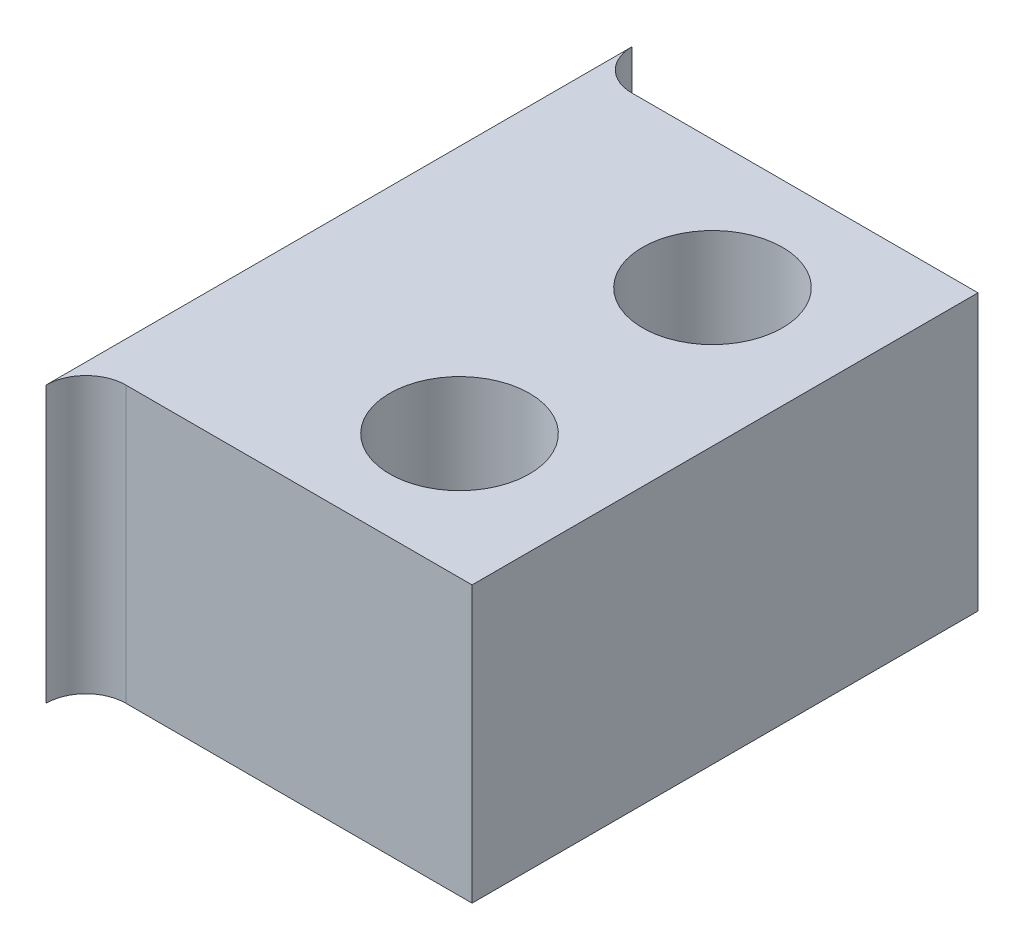
ISO-10303-21;
HEADER;
FILE_DESCRIPTION(('STEP AP214'),'2;1');
FILE_NAME('part.step','',(''),(''),'','','');
FILE_SCHEMA(('AUTOMOTIVE_DESIGN { 1 0 10303 214 1 1 1 1 }'));
ENDSEC;
DATA;
#1=APPLICATION_CONTEXT('core data for automotive mechanical design processes');
#2=APPLICATION_PROTOCOL_DEFINITION('international standard','automotive_design',2000,#1);
#3=PRODUCT_CONTEXT('',#1,'mechanical');
#4=PRODUCT('Part','Part','',(#3));
#5=PRODUCT_RELATED_PRODUCT_CATEGORY('part','',(#4));
#6=PRODUCT_DEFINITION_FORMATION('','',#4);
#7=PRODUCT_DEFINITION_CONTEXT('part definition',#1,'design');
#8=PRODUCT_DEFINITION('design','',#6,#7);
#9=PRODUCT_DEFINITION_SHAPE('','',#8);
#10=(LENGTH_UNIT() NAMED_UNIT(*) SI_UNIT(.MILLI.,.METRE.));
#11=(NAMED_UNIT(*) PLANE_ANGLE_UNIT() SI_UNIT($,.RADIAN.));
#12=(NAMED_UNIT(*) SI_UNIT($,.STERADIAN.) SOLID_ANGLE_UNIT());
#13=UNCERTAINTY_MEASURE_WITH_UNIT(LENGTH_MEASURE(1.E-05),#10,'distance_accuracy_value','');
#14=(GEOMETRIC_REPRESENTATION_CONTEXT(3) GLOBAL_UNCERTAINTY_ASSIGNED_CONTEXT((#13)) GLOBAL_UNIT_ASSIGNED_CONTEXT((#10,
#11,#12)) REPRESENTATION_CONTEXT('',''));
#15=CARTESIAN_POINT('',(0.,0.,0.));
#16=DIRECTION('',(0.,0.,1.));
#17=DIRECTION('',(1.,0.,0.));
#18=AXIS2_PLACEMENT_3D('',#15,#16,#17);
#19=CARTESIAN_POINT('',(47.,0.,0.));
#20=DIRECTION('',(1.,0.,0.));
#21=DIRECTION('',(0.,0.,-1.));
#22=AXIS2_PLACEMENT_3D('',#19,#20,#21);
#23=PLANE('',#22);
#24=DIRECTION('',(0.,0.,-1.));
#25=VECTOR('',#24,1.);
#26=CARTESIAN_POINT('',(47.,-70.7016987325805,77.0000000000002));
#27=LINE('',#26,#25);
#28=CARTESIAN_POINT('',(47.,-70.7016987325805,77.0000000000002));
#29=VERTEX_POINT('',#28);
#30=CARTESIAN_POINT('',(47.,-70.7016987325805,33.0000000000002));
#31=VERTEX_POINT('',#30);
#32=EDGE_CURVE('E94',#29,#31,#27,.T.);
#33=ORIENTED_EDGE('',*,*,#32,.F.);
#34=DIRECTION('',(0.,1.,0.));
#35=VECTOR('',#34,1.);
#36=CARTESIAN_POINT('',(47.,-50.,77.0000000000002));
#37=LINE('',#36,#35);
#38=CARTESIAN_POINT('',(47.,-50.,77.0000000000002));
#39=VERTEX_POINT('',#38);
#40=EDGE_CURVE('E11',#29,#39,#37,.T.);
#41=ORIENTED_EDGE('',*,*,#40,.T.);
#42=DIRECTION('',(0.,0.,1.));
#43=VECTOR('',#42,1.);
#44=CARTESIAN_POINT('',(47.,-50.,0.));
#45=LINE('',#44,#43);
#46=CARTESIAN_POINT('',(47.,-50.,33.0000000000002));
#47=VERTEX_POINT('',#46);
#48=EDGE_CURVE('E37',#47,#39,#45,.T.);
#49=ORIENTED_EDGE('',*,*,#48,.F.);
#50=DIRECTION('',(0.,1.,0.));
#51=VECTOR('',#50,1.);
#52=CARTESIAN_POINT('',(47.,-75.7016987325805,33.0000000000002));
#53=LINE('',#52,#51);
#54=EDGE_CURVE('E42',#47,#31,#53,.F.);
#55=ORIENTED_EDGE('',*,*,#54,.T.);
#56=EDGE_LOOP('',(#33,#41,#49,#55));
#57=FACE_BOUND('',#56,.T.);
#58=ADVANCED_FACE('F34',(#57),#23,.F.);
#59=CARTESIAN_POINT('',(0.,-50.,0.));
#60=DIRECTION('',(0.,-1.,0.));
#61=DIRECTION('',(0.,0.,-1.));
#62=AXIS2_PLACEMENT_3D('',#59,#60,#61);
#63=PLANE('',#62);
#64=CARTESIAN_POINT('',(65.69,-50.,64.6300000000002));
#65=DIRECTION('',(0.,-1.,0.));
#66=DIRECTION('',(0.,0.,-1.));
#67=AXIS2_PLACEMENT_3D('',#64,#65,#66);
#68=CIRCLE('',#67,5.25);
#69=CARTESIAN_POINT('',(65.69,-50.,59.3800000000002));
#70=VERTEX_POINT('',#69);
#71=EDGE_CURVE('E112',#70,#70,#68,.F.);
#72=ORIENTED_EDGE('',*,*,#71,.F.);
#73=EDGE_LOOP('',(#72));
#74=FACE_BOUND('',#73,.T.);
#75=CARTESIAN_POINT('',(50.,-50.,33.0000000000002));
#76=DIRECTION('',(0.,1.,0.));
#77=DIRECTION('',(0.,0.,1.));
#78=AXIS2_PLACEMENT_3D('',#75,#76,#77);
#79=CIRCLE('',#78,3.);
#80=CARTESIAN_POINT('',(50.,-50.,36.0000000000002));
#81=VERTEX_POINT('',#80);
#82=EDGE_CURVE('E106',#81,#47,#79,.F.);
#83=ORIENTED_EDGE('',*,*,#82,.T.);
#84=ORIENTED_EDGE('',*,*,#48,.T.);
#85=CARTESIAN_POINT('',(50.,-50.,77.0000000000002));
#86=DIRECTION('',(0.,1.,0.));
#87=DIRECTION('',(0.,0.,1.));
#88=AXIS2_PLACEMENT_3D('',#85,#86,#87);
#89=CIRCLE('',#88,3.);
#90=CARTESIAN_POINT('',(50.,-50.,74.0000000000002));
#91=VERTEX_POINT('',#90);
#92=EDGE_CURVE('E120',#39,#91,#89,.F.);
#93=ORIENTED_EDGE('',*,*,#92,.T.);
#94=DIRECTION('',(-1.,0.,0.));
#95=VECTOR('',#94,1.);
#96=CARTESIAN_POINT('',(0.,-50.,74.0000000000002));
#97=LINE('',#96,#95);
#98=CARTESIAN_POINT('',(76.,-50.,74.0000000000002));
#99=VERTEX_POINT('',#98);
#100=EDGE_CURVE('E115',#99,#91,#97,.T.);
#101=ORIENTED_EDGE('',*,*,#100,.F.);
#102=DIRECTION('',(0.,0.,1.));
#103=VECTOR('',#102,1.);
#104=CARTESIAN_POINT('',(76.,-50.,36.0000000000002));
#105=LINE('',#104,#103);
#106=CARTESIAN_POINT('',(76.,-50.,36.0000000000002));
#107=VERTEX_POINT('',#106);
#108=EDGE_CURVE('E108',#107,#99,#105,.T.);
#109=ORIENTED_EDGE('',*,*,#108,.F.);
#110=DIRECTION('',(1.,0.,0.));
#111=VECTOR('',#110,1.);
#112=CARTESIAN_POINT('',(1.02695629777827E-13,-50.,36.0000000000001));
#113=LINE('',#112,#111);
#114=EDGE_CURVE('E140',#81,#107,#113,.T.);
#115=ORIENTED_EDGE('',*,*,#114,.F.);
#116=EDGE_LOOP('',(#83,#84,#93,#101,#109,#115));
#117=FACE_BOUND('',#116,.T.);
#118=CARTESIAN_POINT('',(65.69,-50.,45.6300000000002));
#119=DIRECTION('',(0.,-1.,0.));
#120=DIRECTION('',(0.,0.,-1.));
#121=AXIS2_PLACEMENT_3D('',#118,#119,#120);
#122=CIRCLE('',#121,5.25);
#123=CARTESIAN_POINT('',(65.69,-50.,40.3800000000002));
#124=VERTEX_POINT('',#123);
#125=EDGE_CURVE('E121',#124,#124,#122,.F.);
#126=ORIENTED_EDGE('',*,*,#125,.F.);
#127=EDGE_LOOP('',(#126));
#128=FACE_BOUND('',#127,.T.);
#129=ADVANCED_FACE('F146',(#74,#117,#128),#63,.F.);
#130=CARTESIAN_POINT('',(65.69,-47.,64.6300000000002));
#131=DIRECTION('',(0.,1.,0.));
#132=DIRECTION('',(0.,0.,1.));
#133=AXIS2_PLACEMENT_3D('',#130,#131,#132);
#134=CYLINDRICAL_SURFACE('',#133,5.25);
#135=ORIENTED_EDGE('',*,*,#71,.T.);
#136=EDGE_LOOP('',(#135));
#137=FACE_BOUND('',#136,.T.);
#138=CARTESIAN_POINT('',(65.69,-70.7016987325805,64.6300000000002));
#139=DIRECTION('',(0.,-1.,0.));
#140=DIRECTION('',(0.,0.,-1.));
#141=AXIS2_PLACEMENT_3D('',#138,#139,#140);
#142=CIRCLE('',#141,5.25);
#143=CARTESIAN_POINT('',(65.69,-70.7016987325805,59.3800000000002));
#144=VERTEX_POINT('',#143);
#145=EDGE_CURVE('E128',#144,#144,#142,.F.);
#146=ORIENTED_EDGE('',*,*,#145,.F.);
#147=EDGE_LOOP('',(#146));
#148=FACE_BOUND('',#147,.T.);
#149=ADVANCED_FACE('F177',(#137,#148),#134,.F.);
#150=CARTESIAN_POINT('',(65.69,-47.,45.6300000000002));
#151=DIRECTION('',(0.,1.,0.));
#152=DIRECTION('',(0.,0.,1.));
#153=AXIS2_PLACEMENT_3D('',#150,#151,#152);
#154=CYLINDRICAL_SURFACE('',#153,5.25);
#155=ORIENTED_EDGE('',*,*,#125,.T.);
#156=EDGE_LOOP('',(#155));
#157=FACE_BOUND('',#156,.T.);
#158=CARTESIAN_POINT('',(65.69,-70.7016987325805,45.6300000000002));
#159=DIRECTION('',(0.,-1.,0.));
#160=DIRECTION('',(0.,0.,-1.));
#161=AXIS2_PLACEMENT_3D('',#158,#159,#160);
#162=CIRCLE('',#161,5.25);
#163=CARTESIAN_POINT('',(65.69,-70.7016987325805,40.3800000000002));
#164=VERTEX_POINT('',#163);
#165=EDGE_CURVE('E126',#164,#164,#162,.F.);
#166=ORIENTED_EDGE('',*,*,#165,.F.);
#167=EDGE_LOOP('',(#166));
#168=FACE_BOUND('',#167,.T.);
#169=ADVANCED_FACE('F188',(#157,#168),#154,.F.);
#170=CARTESIAN_POINT('',(50.,54.1201229350025,77.0000000000002));
#171=DIRECTION('',(0.,-1.,0.));
#172=DIRECTION('',(0.,0.,-1.));
#173=AXIS2_PLACEMENT_3D('',#170,#171,#172);
#174=CYLINDRICAL_SURFACE('',#173,3.);
#175=CARTESIAN_POINT('',(50.,-70.7016987325805,77.0000000000002));
#176=DIRECTION('',(0.,1.,0.));
#177=DIRECTION('',(0.,0.,-1.));
#178=AXIS2_PLACEMENT_3D('',#175,#176,#177);
#179=CIRCLE('',#178,3.);
#180=CARTESIAN_POINT('',(50.,-70.7016987325805,74.0000000000002));
#181=VERTEX_POINT('',#180);
#182=EDGE_CURVE('E132',#181,#29,#179,.T.);
#183=ORIENTED_EDGE('',*,*,#182,.F.);
#184=DIRECTION('',(0.,1.,0.));
#185=VECTOR('',#184,1.);
#186=CARTESIAN_POINT('',(50.,-75.7016987325805,74.0000000000002));
#187=LINE('',#186,#185);
#188=EDGE_CURVE('E109',#91,#181,#187,.F.);
#189=ORIENTED_EDGE('',*,*,#188,.F.);
#190=ORIENTED_EDGE('',*,*,#92,.F.);
#191=ORIENTED_EDGE('',*,*,#40,.F.);
#192=EDGE_LOOP('',(#183,#189,#190,#191));
#193=FACE_BOUND('',#192,.T.);
#194=ADVANCED_FACE('F151',(#193),#174,.F.);
#195=CARTESIAN_POINT('',(81.,-211.81128696562,74.0000000000002));
#196=DIRECTION('',(0.,0.,-1.));
#197=DIRECTION('',(-1.,0.,0.));
#198=AXIS2_PLACEMENT_3D('',#195,#196,#197);
#199=PLANE('',#198);
#200=DIRECTION('',(-1.,0.,0.));
#201=VECTOR('',#200,1.);
#202=CARTESIAN_POINT('',(76.,-70.7016987325805,74.0000000000002));
#203=LINE('',#202,#201);
#204=CARTESIAN_POINT('',(76.,-70.7016987325805,74.0000000000002));
#205=VERTEX_POINT('',#204);
#206=EDGE_CURVE('E134',#205,#181,#203,.T.);
#207=ORIENTED_EDGE('',*,*,#206,.F.);
#208=DIRECTION('',(0.,1.,0.));
#209=VECTOR('',#208,1.);
#210=CARTESIAN_POINT('',(76.,-188.,74.0000000000002));
#211=LINE('',#210,#209);
#212=EDGE_CURVE('E138',#205,#99,#211,.T.);
#213=ORIENTED_EDGE('',*,*,#212,.T.);
#214=ORIENTED_EDGE('',*,*,#100,.T.);
#215=ORIENTED_EDGE('',*,*,#188,.T.);
#216=EDGE_LOOP('',(#207,#213,#214,#215));
#217=FACE_BOUND('',#216,.T.);
#218=ADVANCED_FACE('F154',(#217),#199,.F.);
#219=CARTESIAN_POINT('',(76.,-188.,36.0000000000002));
#220=DIRECTION('',(-1.,0.,0.));
#221=DIRECTION('',(0.,0.,1.));
#222=AXIS2_PLACEMENT_3D('',#219,#220,#221);
#223=PLANE('',#222);
#224=DIRECTION('',(0.,0.,1.));
#225=VECTOR('',#224,1.);
#226=CARTESIAN_POINT('',(76.,-70.7016987325805,36.0000000000002));
#227=LINE('',#226,#225);
#228=CARTESIAN_POINT('',(76.,-70.7016987325805,36.0000000000002));
#229=VERTEX_POINT('',#228);
#230=EDGE_CURVE('E103',#229,#205,#227,.T.);
#231=ORIENTED_EDGE('',*,*,#230,.F.);
#232=DIRECTION('',(0.,1.,0.));
#233=VECTOR('',#232,1.);
#234=CARTESIAN_POINT('',(76.,-188.,36.0000000000002));
#235=LINE('',#234,#233);
#236=EDGE_CURVE('E102',#229,#107,#235,.T.);
#237=ORIENTED_EDGE('',*,*,#236,.T.);
#238=ORIENTED_EDGE('',*,*,#108,.T.);
#239=ORIENTED_EDGE('',*,*,#212,.F.);
#240=EDGE_LOOP('',(#231,#237,#238,#239));
#241=FACE_BOUND('',#240,.T.);
#242=ADVANCED_FACE('F157',(#241),#223,.F.);
#243=CARTESIAN_POINT('',(81.,-211.81128696562,36.0000000000002));
#244=DIRECTION('',(0.,0.,1.));
#245=DIRECTION('',(1.,0.,0.));
#246=AXIS2_PLACEMENT_3D('',#243,#244,#245);
#247=PLANE('',#246);
#248=DIRECTION('',(1.,0.,0.));
#249=VECTOR('',#248,1.);
#250=CARTESIAN_POINT('',(50.,-70.7016987325805,36.0000000000002));
#251=LINE('',#250,#249);
#252=CARTESIAN_POINT('',(50.,-70.7016987325805,36.0000000000002));
#253=VERTEX_POINT('',#252);
#254=EDGE_CURVE('E90',#253,#229,#251,.T.);
#255=ORIENTED_EDGE('',*,*,#254,.F.);
#256=DIRECTION('',(0.,1.,0.));
#257=VECTOR('',#256,1.);
#258=CARTESIAN_POINT('',(50.,-50.,36.0000000000002));
#259=LINE('',#258,#257);
#260=EDGE_CURVE('E101',#253,#81,#259,.T.);
#261=ORIENTED_EDGE('',*,*,#260,.T.);
#262=ORIENTED_EDGE('',*,*,#114,.T.);
#263=ORIENTED_EDGE('',*,*,#236,.F.);
#264=EDGE_LOOP('',(#255,#261,#262,#263));
#265=FACE_BOUND('',#264,.T.);
#266=ADVANCED_FACE('F99',(#265),#247,.F.);
#267=CARTESIAN_POINT('',(50.,-211.81128696562,33.0000000000002));
#268=DIRECTION('',(0.,-1.,0.));
#269=DIRECTION('',(0.,0.,-1.));
#270=AXIS2_PLACEMENT_3D('',#267,#268,#269);
#271=CYLINDRICAL_SURFACE('',#270,3.);
#272=CARTESIAN_POINT('',(50.,-70.7016987325805,33.0000000000002));
#273=DIRECTION('',(0.,1.,0.));
#274=DIRECTION('',(0.,0.,-1.));
#275=AXIS2_PLACEMENT_3D('',#272,#273,#274);
#276=CIRCLE('',#275,3.);
#277=EDGE_CURVE('E86',#31,#253,#276,.T.);
#278=ORIENTED_EDGE('',*,*,#277,.F.);
#279=ORIENTED_EDGE('',*,*,#54,.F.);
#280=ORIENTED_EDGE('',*,*,#82,.F.);
#281=ORIENTED_EDGE('',*,*,#260,.F.);
#282=EDGE_LOOP('',(#278,#279,#280,#281));
#283=FACE_BOUND('',#282,.T.);
#284=ADVANCED_FACE('F105',(#283),#271,.F.);
#285=CARTESIAN_POINT('',(50.,-70.7016987325805,33.0000000000002));
#286=DIRECTION('',(0.,-1.,0.));
#287=DIRECTION('',(0.,0.,-1.));
#288=AXIS2_PLACEMENT_3D('',#285,#286,#287);
#289=PLANE('',#288);
#290=ORIENTED_EDGE('',*,*,#277,.T.);
#291=ORIENTED_EDGE('',*,*,#254,.T.);
#292=ORIENTED_EDGE('',*,*,#230,.T.);
#293=ORIENTED_EDGE('',*,*,#206,.T.);
#294=ORIENTED_EDGE('',*,*,#182,.T.);
#295=ORIENTED_EDGE('',*,*,#32,.T.);
#296=EDGE_LOOP('',(#290,#291,#292,#293,#294,#295));
#297=FACE_BOUND('',#296,.T.);
#298=ORIENTED_EDGE('',*,*,#165,.T.);
#299=EDGE_LOOP('',(#298));
#300=FACE_BOUND('',#299,.T.);
#301=ORIENTED_EDGE('',*,*,#145,.T.);
#302=EDGE_LOOP('',(#301));
#303=FACE_BOUND('',#302,.T.);
#304=ADVANCED_FACE('F88',(#297,#300,#303),#289,.T.);
#305=CLOSED_SHELL('',(#58,#129,#149,#169,#194,#218,#242,#266,#284,#304));
#306=MANIFOLD_SOLID_BREP('B2',#305);
#307=ADVANCED_BREP_SHAPE_REPRESENTATION('',(#18,#306),#14);
#308=SHAPE_DEFINITION_REPRESENTATION(#9,#307);
ENDSEC;
END-ISO-10303-21;
